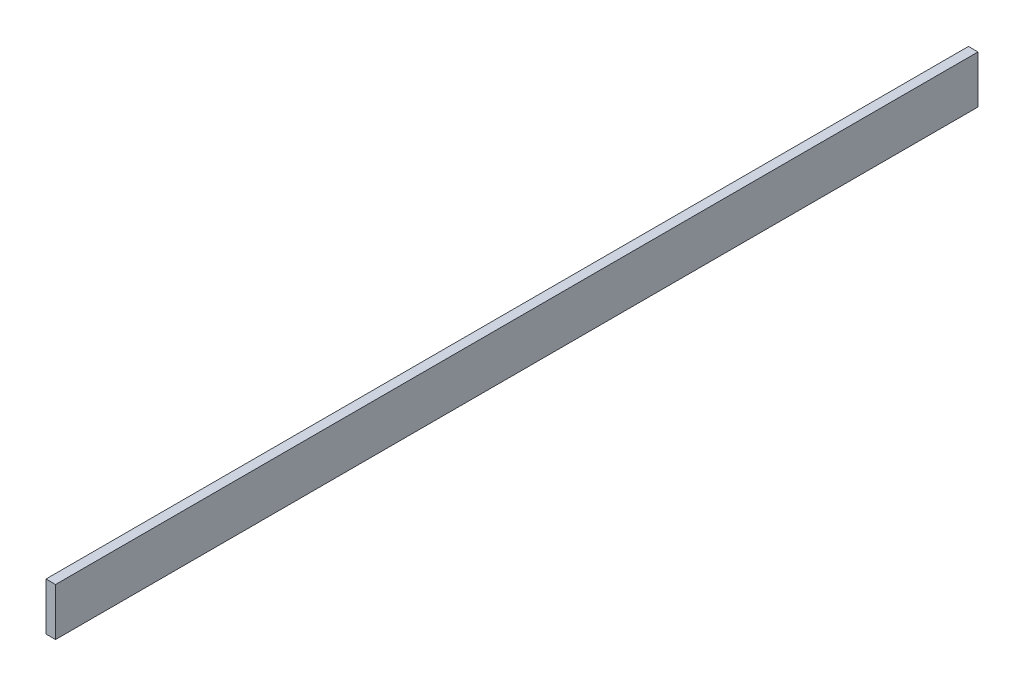
ISO-10303-21;
HEADER;
FILE_DESCRIPTION(('STEP AP214'),'2;1');
FILE_NAME('part.step','',(''),(''),'','','');
FILE_SCHEMA(('AUTOMOTIVE_DESIGN { 1 0 10303 214 1 1 1 1 }'));
ENDSEC;
DATA;
#1=APPLICATION_CONTEXT('core data for automotive mechanical design processes');
#2=APPLICATION_PROTOCOL_DEFINITION('international standard','automotive_design',2000,#1);
#3=PRODUCT_CONTEXT('',#1,'mechanical');
#4=PRODUCT('Part','Part','',(#3));
#5=PRODUCT_RELATED_PRODUCT_CATEGORY('part','',(#4));
#6=PRODUCT_DEFINITION_FORMATION('','',#4);
#7=PRODUCT_DEFINITION_CONTEXT('part definition',#1,'design');
#8=PRODUCT_DEFINITION('design','',#6,#7);
#9=PRODUCT_DEFINITION_SHAPE('','',#8);
#10=(LENGTH_UNIT() NAMED_UNIT(*) SI_UNIT(.MILLI.,.METRE.));
#11=(NAMED_UNIT(*) PLANE_ANGLE_UNIT() SI_UNIT($,.RADIAN.));
#12=(NAMED_UNIT(*) SI_UNIT($,.STERADIAN.) SOLID_ANGLE_UNIT());
#13=UNCERTAINTY_MEASURE_WITH_UNIT(LENGTH_MEASURE(1.E-05),#10,'distance_accuracy_value','');
#14=(GEOMETRIC_REPRESENTATION_CONTEXT(3) GLOBAL_UNCERTAINTY_ASSIGNED_CONTEXT((#13)) GLOBAL_UNIT_ASSIGNED_CONTEXT((#10,
#11,#12)) REPRESENTATION_CONTEXT('',''));
#15=CARTESIAN_POINT('',(0.,0.,0.));
#16=DIRECTION('',(0.,0.,1.));
#17=DIRECTION('',(1.,0.,0.));
#18=AXIS2_PLACEMENT_3D('',#15,#16,#17);
#19=CARTESIAN_POINT('',(3.,0.,0.));
#20=DIRECTION('',(0.,0.,-1.));
#21=DIRECTION('',(-1.,0.,0.));
#22=AXIS2_PLACEMENT_3D('',#19,#20,#21);
#23=PLANE('',#22);
#24=DIRECTION('',(0.,-1.,0.));
#25=VECTOR('',#24,1.);
#26=CARTESIAN_POINT('',(0.,0.,0.));
#27=LINE('',#26,#25);
#28=CARTESIAN_POINT('',(0.,15.,0.));
#29=VERTEX_POINT('',#28);
#30=CARTESIAN_POINT('',(0.,0.,0.));
#31=VERTEX_POINT('',#30);
#32=EDGE_CURVE('E98',#29,#31,#27,.T.);
#33=ORIENTED_EDGE('',*,*,#32,.T.);
#34=DIRECTION('',(-1.,0.,0.));
#35=VECTOR('',#34,1.);
#36=CARTESIAN_POINT('',(3.,0.,0.));
#37=LINE('',#36,#35);
#38=CARTESIAN_POINT('',(3.,0.,0.));
#39=VERTEX_POINT('',#38);
#40=EDGE_CURVE('E11',#39,#31,#37,.T.);
#41=ORIENTED_EDGE('',*,*,#40,.F.);
#42=DIRECTION('',(0.,-1.,0.));
#43=VECTOR('',#42,1.);
#44=CARTESIAN_POINT('',(3.,0.,0.));
#45=LINE('',#44,#43);
#46=CARTESIAN_POINT('',(3.,15.,0.));
#47=VERTEX_POINT('',#46);
#48=EDGE_CURVE('E86',#47,#39,#45,.T.);
#49=ORIENTED_EDGE('',*,*,#48,.F.);
#50=DIRECTION('',(-1.,0.,0.));
#51=VECTOR('',#50,1.);
#52=CARTESIAN_POINT('',(3.,15.,0.));
#53=LINE('',#52,#51);
#54=EDGE_CURVE('E94',#47,#29,#53,.T.);
#55=ORIENTED_EDGE('',*,*,#54,.T.);
#56=EDGE_LOOP('',(#33,#41,#49,#55));
#57=FACE_BOUND('',#56,.T.);
#58=ADVANCED_FACE('F35',(#57),#23,.F.);
#59=CARTESIAN_POINT('',(3.,0.,0.));
#60=DIRECTION('',(0.,1.,0.));
#61=DIRECTION('',(0.,0.,1.));
#62=AXIS2_PLACEMENT_3D('',#59,#60,#61);
#63=PLANE('',#62);
#64=DIRECTION('',(0.,0.,-1.));
#65=VECTOR('',#64,1.);
#66=CARTESIAN_POINT('',(0.,0.,0.));
#67=LINE('',#66,#65);
#68=CARTESIAN_POINT('',(0.,0.,-290.));
#69=VERTEX_POINT('',#68);
#70=EDGE_CURVE('E90',#31,#69,#67,.T.);
#71=ORIENTED_EDGE('',*,*,#70,.T.);
#72=DIRECTION('',(-1.,0.,0.));
#73=VECTOR('',#72,1.);
#74=CARTESIAN_POINT('',(3.,0.,-290.));
#75=LINE('',#74,#73);
#76=CARTESIAN_POINT('',(3.,0.,-290.));
#77=VERTEX_POINT('',#76);
#78=EDGE_CURVE('E43',#77,#69,#75,.T.);
#79=ORIENTED_EDGE('',*,*,#78,.F.);
#80=DIRECTION('',(0.,0.,-1.));
#81=VECTOR('',#80,1.);
#82=CARTESIAN_POINT('',(3.,0.,0.));
#83=LINE('',#82,#81);
#84=EDGE_CURVE('E81',#39,#77,#83,.T.);
#85=ORIENTED_EDGE('',*,*,#84,.F.);
#86=ORIENTED_EDGE('',*,*,#40,.T.);
#87=EDGE_LOOP('',(#71,#79,#85,#86));
#88=FACE_BOUND('',#87,.T.);
#89=ADVANCED_FACE('F89',(#88),#63,.F.);
#90=CARTESIAN_POINT('',(3.,0.,-290.));
#91=DIRECTION('',(0.,0.,1.));
#92=DIRECTION('',(1.,0.,0.));
#93=AXIS2_PLACEMENT_3D('',#90,#91,#92);
#94=PLANE('',#93);
#95=DIRECTION('',(0.,1.,0.));
#96=VECTOR('',#95,1.);
#97=CARTESIAN_POINT('',(0.,0.,-290.));
#98=LINE('',#97,#96);
#99=CARTESIAN_POINT('',(0.,15.,-290.));
#100=VERTEX_POINT('',#99);
#101=EDGE_CURVE('E68',#69,#100,#98,.T.);
#102=ORIENTED_EDGE('',*,*,#101,.T.);
#103=DIRECTION('',(-1.,0.,0.));
#104=VECTOR('',#103,1.);
#105=CARTESIAN_POINT('',(3.,15.,-290.));
#106=LINE('',#105,#104);
#107=CARTESIAN_POINT('',(3.,15.,-290.));
#108=VERTEX_POINT('',#107);
#109=EDGE_CURVE('E91',#108,#100,#106,.T.);
#110=ORIENTED_EDGE('',*,*,#109,.F.);
#111=DIRECTION('',(0.,1.,0.));
#112=VECTOR('',#111,1.);
#113=CARTESIAN_POINT('',(3.,0.,-290.));
#114=LINE('',#113,#112);
#115=EDGE_CURVE('E84',#77,#108,#114,.T.);
#116=ORIENTED_EDGE('',*,*,#115,.F.);
#117=ORIENTED_EDGE('',*,*,#78,.T.);
#118=EDGE_LOOP('',(#102,#110,#116,#117));
#119=FACE_BOUND('',#118,.T.);
#120=ADVANCED_FACE('F92',(#119),#94,.F.);
#121=CARTESIAN_POINT('',(3.,15.,0.));
#122=DIRECTION('',(0.,-1.,0.));
#123=DIRECTION('',(0.,0.,-1.));
#124=AXIS2_PLACEMENT_3D('',#121,#122,#123);
#125=PLANE('',#124);
#126=DIRECTION('',(0.,0.,1.));
#127=VECTOR('',#126,1.);
#128=CARTESIAN_POINT('',(0.,15.,0.));
#129=LINE('',#128,#127);
#130=EDGE_CURVE('E74',#100,#29,#129,.T.);
#131=ORIENTED_EDGE('',*,*,#130,.T.);
#132=ORIENTED_EDGE('',*,*,#54,.F.);
#133=DIRECTION('',(0.,0.,1.));
#134=VECTOR('',#133,1.);
#135=CARTESIAN_POINT('',(3.,15.,0.));
#136=LINE('',#135,#134);
#137=EDGE_CURVE('E51',#108,#47,#136,.T.);
#138=ORIENTED_EDGE('',*,*,#137,.F.);
#139=ORIENTED_EDGE('',*,*,#109,.T.);
#140=EDGE_LOOP('',(#131,#132,#138,#139));
#141=FACE_BOUND('',#140,.T.);
#142=ADVANCED_FACE('F105',(#141),#125,.F.);
#143=CARTESIAN_POINT('',(3.,0.,0.));
#144=DIRECTION('',(-1.,0.,0.));
#145=DIRECTION('',(0.,0.,1.));
#146=AXIS2_PLACEMENT_3D('',#143,#144,#145);
#147=PLANE('',#146);
#148=ORIENTED_EDGE('',*,*,#48,.T.);
#149=ORIENTED_EDGE('',*,*,#84,.T.);
#150=ORIENTED_EDGE('',*,*,#115,.T.);
#151=ORIENTED_EDGE('',*,*,#137,.T.);
#152=EDGE_LOOP('',(#148,#149,#150,#151));
#153=FACE_BOUND('',#152,.T.);
#154=ADVANCED_FACE('F82',(#153),#147,.F.);
#155=CARTESIAN_POINT('',(0.,0.,0.));
#156=DIRECTION('',(-1.,0.,0.));
#157=DIRECTION('',(0.,0.,1.));
#158=AXIS2_PLACEMENT_3D('',#155,#156,#157);
#159=PLANE('',#158);
#160=ORIENTED_EDGE('',*,*,#32,.F.);
#161=ORIENTED_EDGE('',*,*,#130,.F.);
#162=ORIENTED_EDGE('',*,*,#101,.F.);
#163=ORIENTED_EDGE('',*,*,#70,.F.);
#164=EDGE_LOOP('',(#160,#161,#162,#163));
#165=FACE_BOUND('',#164,.T.);
#166=ADVANCED_FACE('F108',(#165),#159,.T.);
#167=CLOSED_SHELL('',(#58,#89,#120,#142,#154,#166));
#168=MANIFOLD_SOLID_BREP('B2',#167);
#169=ADVANCED_BREP_SHAPE_REPRESENTATION('',(#18,#168),#14);
#170=SHAPE_DEFINITION_REPRESENTATION(#9,#169);
ENDSEC;
END-ISO-10303-21;
